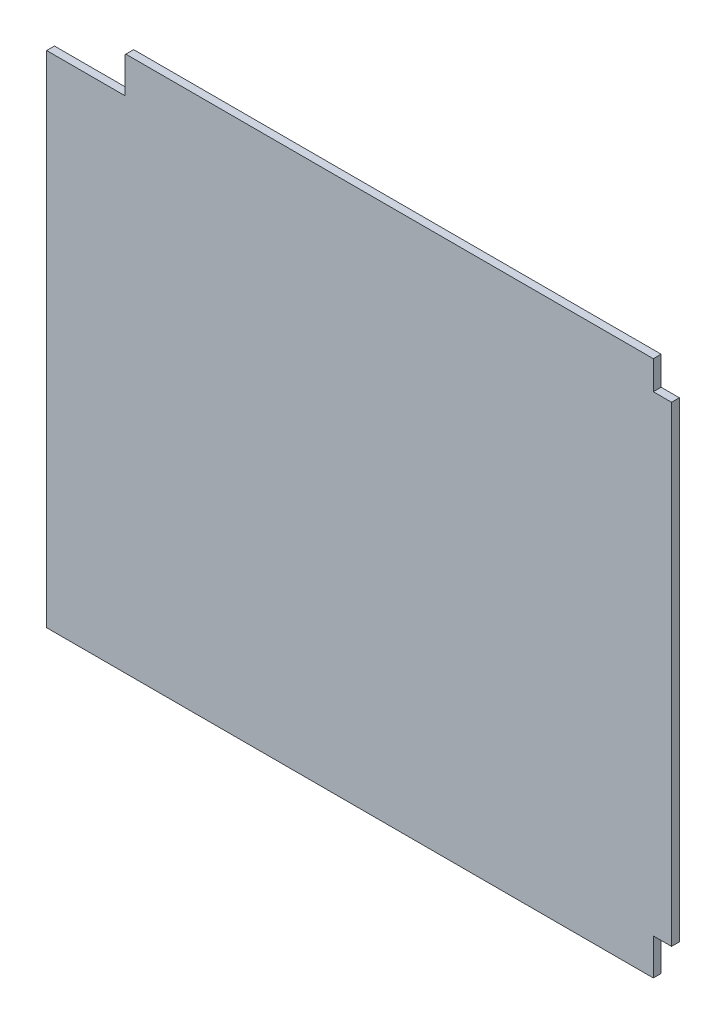
ISO-10303-21;
HEADER;
FILE_DESCRIPTION(('STEP AP214'),'2;1');
FILE_NAME('part.step','',(''),(''),'','','');
FILE_SCHEMA(('AUTOMOTIVE_DESIGN { 1 0 10303 214 1 1 1 1 }'));
ENDSEC;
DATA;
#1=APPLICATION_CONTEXT('core data for automotive mechanical design processes');
#2=APPLICATION_PROTOCOL_DEFINITION('international standard','automotive_design',2000,#1);
#3=PRODUCT_CONTEXT('',#1,'mechanical');
#4=PRODUCT('Part','Part','',(#3));
#5=PRODUCT_RELATED_PRODUCT_CATEGORY('part','',(#4));
#6=PRODUCT_DEFINITION_FORMATION('','',#4);
#7=PRODUCT_DEFINITION_CONTEXT('part definition',#1,'design');
#8=PRODUCT_DEFINITION('design','',#6,#7);
#9=PRODUCT_DEFINITION_SHAPE('','',#8);
#10=(LENGTH_UNIT() NAMED_UNIT(*) SI_UNIT(.MILLI.,.METRE.));
#11=(NAMED_UNIT(*) PLANE_ANGLE_UNIT() SI_UNIT($,.RADIAN.));
#12=(NAMED_UNIT(*) SI_UNIT($,.STERADIAN.) SOLID_ANGLE_UNIT());
#13=UNCERTAINTY_MEASURE_WITH_UNIT(LENGTH_MEASURE(1.E-05),#10,'distance_accuracy_value','');
#14=(GEOMETRIC_REPRESENTATION_CONTEXT(3) GLOBAL_UNCERTAINTY_ASSIGNED_CONTEXT((#13)) GLOBAL_UNIT_ASSIGNED_CONTEXT((#10,
#11,#12)) REPRESENTATION_CONTEXT('',''));
#15=CARTESIAN_POINT('',(0.,0.,0.));
#16=DIRECTION('',(0.,0.,1.));
#17=DIRECTION('',(1.,0.,0.));
#18=AXIS2_PLACEMENT_3D('',#15,#16,#17);
#19=CARTESIAN_POINT('',(0.,82.4496359223304,3.));
#20=DIRECTION('',(0.,-1.,0.));
#21=DIRECTION('',(0.,0.,-1.));
#22=AXIS2_PLACEMENT_3D('',#19,#20,#21);
#23=PLANE('',#22);
#24=DIRECTION('',(-1.,0.,0.));
#25=VECTOR('',#24,1.);
#26=CARTESIAN_POINT('',(0.,82.4496359223304,0.));
#27=LINE('',#26,#25);
#28=CARTESIAN_POINT('',(-87.0384595395548,82.4496359223304,0.));
#29=VERTEX_POINT('',#28);
#30=CARTESIAN_POINT('',(-117.038459539553,82.4496359223304,0.));
#31=VERTEX_POINT('',#30);
#32=EDGE_CURVE('E164',#29,#31,#27,.T.);
#33=ORIENTED_EDGE('',*,*,#32,.T.);
#34=DIRECTION('',(0.,0.,-1.));
#35=VECTOR('',#34,1.);
#36=CARTESIAN_POINT('',(-117.038459539553,82.4496359223304,3.));
#37=LINE('',#36,#35);
#38=CARTESIAN_POINT('',(-117.038459539553,82.4496359223304,3.));
#39=VERTEX_POINT('',#38);
#40=EDGE_CURVE('E11',#39,#31,#37,.T.);
#41=ORIENTED_EDGE('',*,*,#40,.F.);
#42=DIRECTION('',(-1.,0.,0.));
#43=VECTOR('',#42,1.);
#44=CARTESIAN_POINT('',(0.,82.4496359223304,3.));
#45=LINE('',#44,#43);
#46=CARTESIAN_POINT('',(-87.0384595395548,82.4496359223304,3.));
#47=VERTEX_POINT('',#46);
#48=EDGE_CURVE('E195',#47,#39,#45,.T.);
#49=ORIENTED_EDGE('',*,*,#48,.F.);
#50=DIRECTION('',(0.,0.,-1.));
#51=VECTOR('',#50,1.);
#52=CARTESIAN_POINT('',(-87.0384595395548,82.4496359223304,3.));
#53=LINE('',#52,#51);
#54=EDGE_CURVE('E160',#47,#29,#53,.T.);
#55=ORIENTED_EDGE('',*,*,#54,.T.);
#56=EDGE_LOOP('',(#33,#41,#49,#55));
#57=FACE_BOUND('',#56,.T.);
#58=ADVANCED_FACE('F45',(#57),#23,.F.);
#59=CARTESIAN_POINT('',(-117.038459539553,0.,3.));
#60=DIRECTION('',(1.,0.,0.));
#61=DIRECTION('',(0.,0.,-1.));
#62=AXIS2_PLACEMENT_3D('',#59,#60,#61);
#63=PLANE('',#62);
#64=DIRECTION('',(0.,-1.,0.));
#65=VECTOR('',#64,1.);
#66=CARTESIAN_POINT('',(-117.038459539553,0.,0.));
#67=LINE('',#66,#65);
#68=CARTESIAN_POINT('',(-117.038459539553,-109.55036407767,0.));
#69=VERTEX_POINT('',#68);
#70=EDGE_CURVE('E168',#31,#69,#67,.T.);
#71=ORIENTED_EDGE('',*,*,#70,.T.);
#72=DIRECTION('',(0.,0.,-1.));
#73=VECTOR('',#72,1.);
#74=CARTESIAN_POINT('',(-117.038459539553,-109.55036407767,3.));
#75=LINE('',#74,#73);
#76=CARTESIAN_POINT('',(-117.038459539553,-109.55036407767,3.));
#77=VERTEX_POINT('',#76);
#78=EDGE_CURVE('E54',#77,#69,#75,.T.);
#79=ORIENTED_EDGE('',*,*,#78,.F.);
#80=DIRECTION('',(0.,-1.,0.));
#81=VECTOR('',#80,1.);
#82=CARTESIAN_POINT('',(-117.038459539553,0.,3.));
#83=LINE('',#82,#81);
#84=EDGE_CURVE('E114',#39,#77,#83,.T.);
#85=ORIENTED_EDGE('',*,*,#84,.F.);
#86=ORIENTED_EDGE('',*,*,#40,.T.);
#87=EDGE_LOOP('',(#71,#79,#85,#86));
#88=FACE_BOUND('',#87,.T.);
#89=ADVANCED_FACE('F281',(#88),#63,.F.);
#90=CARTESIAN_POINT('',(0.,-109.55036407767,3.));
#91=DIRECTION('',(0.,1.,0.));
#92=DIRECTION('',(0.,0.,1.));
#93=AXIS2_PLACEMENT_3D('',#90,#91,#92);
#94=PLANE('',#93);
#95=DIRECTION('',(1.,0.,0.));
#96=VECTOR('',#95,1.);
#97=CARTESIAN_POINT('',(0.,-109.55036407767,0.));
#98=LINE('',#97,#96);
#99=CARTESIAN_POINT('',(115.961540460445,-109.55036407767,0.));
#100=VERTEX_POINT('',#99);
#101=EDGE_CURVE('E171',#69,#100,#98,.T.);
#102=ORIENTED_EDGE('',*,*,#101,.T.);
#103=DIRECTION('',(0.,0.,-1.));
#104=VECTOR('',#103,1.);
#105=CARTESIAN_POINT('',(115.961540460445,-109.55036407767,3.));
#106=LINE('',#105,#104);
#107=CARTESIAN_POINT('',(115.961540460445,-109.55036407767,3.));
#108=VERTEX_POINT('',#107);
#109=EDGE_CURVE('E218',#108,#100,#106,.T.);
#110=ORIENTED_EDGE('',*,*,#109,.F.);
#111=DIRECTION('',(1.,0.,0.));
#112=VECTOR('',#111,1.);
#113=CARTESIAN_POINT('',(0.,-109.55036407767,3.));
#114=LINE('',#113,#112);
#115=EDGE_CURVE('E228',#77,#108,#114,.T.);
#116=ORIENTED_EDGE('',*,*,#115,.F.);
#117=ORIENTED_EDGE('',*,*,#78,.T.);
#118=EDGE_LOOP('',(#102,#110,#116,#117));
#119=FACE_BOUND('',#118,.T.);
#120=ADVANCED_FACE('F226',(#119),#94,.F.);
#121=CARTESIAN_POINT('',(115.961540460445,0.,3.));
#122=DIRECTION('',(-1.,0.,0.));
#123=DIRECTION('',(0.,0.,1.));
#124=AXIS2_PLACEMENT_3D('',#121,#122,#123);
#125=PLANE('',#124);
#126=DIRECTION('',(0.,1.,0.));
#127=VECTOR('',#126,1.);
#128=CARTESIAN_POINT('',(115.961540460445,0.,0.));
#129=LINE('',#128,#127);
#130=CARTESIAN_POINT('',(115.961540460445,-95.5503640776701,0.));
#131=VERTEX_POINT('',#130);
#132=EDGE_CURVE('E174',#100,#131,#129,.T.);
#133=ORIENTED_EDGE('',*,*,#132,.T.);
#134=DIRECTION('',(0.,0.,-1.));
#135=VECTOR('',#134,1.);
#136=CARTESIAN_POINT('',(115.961540460445,-95.5503640776701,3.));
#137=LINE('',#136,#135);
#138=CARTESIAN_POINT('',(115.961540460445,-95.5503640776701,3.));
#139=VERTEX_POINT('',#138);
#140=EDGE_CURVE('E214',#139,#131,#137,.T.);
#141=ORIENTED_EDGE('',*,*,#140,.F.);
#142=DIRECTION('',(0.,1.,0.));
#143=VECTOR('',#142,1.);
#144=CARTESIAN_POINT('',(115.961540460445,0.,3.));
#145=LINE('',#144,#143);
#146=EDGE_CURVE('E247',#108,#139,#145,.T.);
#147=ORIENTED_EDGE('',*,*,#146,.F.);
#148=ORIENTED_EDGE('',*,*,#109,.T.);
#149=EDGE_LOOP('',(#133,#141,#147,#148));
#150=FACE_BOUND('',#149,.T.);
#151=ADVANCED_FACE('F237',(#150),#125,.F.);
#152=CARTESIAN_POINT('',(0.,-95.5503640776701,3.));
#153=DIRECTION('',(0.,1.,0.));
#154=DIRECTION('',(0.,0.,1.));
#155=AXIS2_PLACEMENT_3D('',#152,#153,#154);
#156=PLANE('',#155);
#157=DIRECTION('',(1.,0.,0.));
#158=VECTOR('',#157,1.);
#159=CARTESIAN_POINT('',(0.,-95.5503640776701,0.));
#160=LINE('',#159,#158);
#161=CARTESIAN_POINT('',(122.961540460445,-95.5503640776701,0.));
#162=VERTEX_POINT('',#161);
#163=EDGE_CURVE('E177',#131,#162,#160,.T.);
#164=ORIENTED_EDGE('',*,*,#163,.T.);
#165=DIRECTION('',(0.,0.,-1.));
#166=VECTOR('',#165,1.);
#167=CARTESIAN_POINT('',(122.961540460445,-95.5503640776701,3.));
#168=LINE('',#167,#166);
#169=CARTESIAN_POINT('',(122.961540460445,-95.5503640776701,3.));
#170=VERTEX_POINT('',#169);
#171=EDGE_CURVE('E210',#170,#162,#168,.T.);
#172=ORIENTED_EDGE('',*,*,#171,.F.);
#173=DIRECTION('',(1.,0.,0.));
#174=VECTOR('',#173,1.);
#175=CARTESIAN_POINT('',(0.,-95.5503640776701,3.));
#176=LINE('',#175,#174);
#177=EDGE_CURVE('E243',#139,#170,#176,.T.);
#178=ORIENTED_EDGE('',*,*,#177,.F.);
#179=ORIENTED_EDGE('',*,*,#140,.T.);
#180=EDGE_LOOP('',(#164,#172,#178,#179));
#181=FACE_BOUND('',#180,.T.);
#182=ADVANCED_FACE('F241',(#181),#156,.F.);
#183=CARTESIAN_POINT('',(122.961540460445,0.,3.));
#184=DIRECTION('',(-1.,0.,0.));
#185=DIRECTION('',(0.,0.,1.));
#186=AXIS2_PLACEMENT_3D('',#183,#184,#185);
#187=PLANE('',#186);
#188=DIRECTION('',(0.,1.,0.));
#189=VECTOR('',#188,1.);
#190=CARTESIAN_POINT('',(122.961540460445,0.,0.));
#191=LINE('',#190,#189);
#192=CARTESIAN_POINT('',(122.961540460445,85.449635922332,0.));
#193=VERTEX_POINT('',#192);
#194=EDGE_CURVE('E180',#162,#193,#191,.T.);
#195=ORIENTED_EDGE('',*,*,#194,.T.);
#196=DIRECTION('',(0.,0.,-1.));
#197=VECTOR('',#196,1.);
#198=CARTESIAN_POINT('',(122.961540460445,85.449635922332,3.));
#199=LINE('',#198,#197);
#200=CARTESIAN_POINT('',(122.961540460445,85.449635922332,3.));
#201=VERTEX_POINT('',#200);
#202=EDGE_CURVE('E206',#201,#193,#199,.T.);
#203=ORIENTED_EDGE('',*,*,#202,.F.);
#204=DIRECTION('',(0.,1.,0.));
#205=VECTOR('',#204,1.);
#206=CARTESIAN_POINT('',(122.961540460445,0.,3.));
#207=LINE('',#206,#205);
#208=EDGE_CURVE('E246',#170,#201,#207,.T.);
#209=ORIENTED_EDGE('',*,*,#208,.F.);
#210=ORIENTED_EDGE('',*,*,#171,.T.);
#211=EDGE_LOOP('',(#195,#203,#209,#210));
#212=FACE_BOUND('',#211,.T.);
#213=ADVANCED_FACE('F294',(#212),#187,.F.);
#214=CARTESIAN_POINT('',(0.,85.449635922332,3.));
#215=DIRECTION('',(0.,-1.,0.));
#216=DIRECTION('',(0.,0.,-1.));
#217=AXIS2_PLACEMENT_3D('',#214,#215,#216);
#218=PLANE('',#217);
#219=DIRECTION('',(-1.,0.,0.));
#220=VECTOR('',#219,1.);
#221=CARTESIAN_POINT('',(0.,85.449635922332,0.));
#222=LINE('',#221,#220);
#223=CARTESIAN_POINT('',(115.961540460445,85.449635922332,0.));
#224=VERTEX_POINT('',#223);
#225=EDGE_CURVE('E183',#193,#224,#222,.T.);
#226=ORIENTED_EDGE('',*,*,#225,.T.);
#227=DIRECTION('',(0.,0.,-1.));
#228=VECTOR('',#227,1.);
#229=CARTESIAN_POINT('',(115.961540460445,85.449635922332,3.));
#230=LINE('',#229,#228);
#231=CARTESIAN_POINT('',(115.961540460445,85.449635922332,3.));
#232=VERTEX_POINT('',#231);
#233=EDGE_CURVE('E202',#232,#224,#230,.T.);
#234=ORIENTED_EDGE('',*,*,#233,.F.);
#235=DIRECTION('',(-1.,0.,0.));
#236=VECTOR('',#235,1.);
#237=CARTESIAN_POINT('',(0.,85.449635922332,3.));
#238=LINE('',#237,#236);
#239=EDGE_CURVE('E251',#201,#232,#238,.T.);
#240=ORIENTED_EDGE('',*,*,#239,.F.);
#241=ORIENTED_EDGE('',*,*,#202,.T.);
#242=EDGE_LOOP('',(#226,#234,#240,#241));
#243=FACE_BOUND('',#242,.T.);
#244=ADVANCED_FACE('F262',(#243),#218,.F.);
#245=CARTESIAN_POINT('',(115.961540460445,0.,3.));
#246=DIRECTION('',(-1.,0.,0.));
#247=DIRECTION('',(0.,0.,1.));
#248=AXIS2_PLACEMENT_3D('',#245,#246,#247);
#249=PLANE('',#248);
#250=DIRECTION('',(0.,1.,0.));
#251=VECTOR('',#250,1.);
#252=CARTESIAN_POINT('',(115.961540460445,0.,0.));
#253=LINE('',#252,#251);
#254=CARTESIAN_POINT('',(115.961540460445,96.4496359223304,0.));
#255=VERTEX_POINT('',#254);
#256=EDGE_CURVE('E186',#224,#255,#253,.T.);
#257=ORIENTED_EDGE('',*,*,#256,.T.);
#258=DIRECTION('',(0.,0.,-1.));
#259=VECTOR('',#258,1.);
#260=CARTESIAN_POINT('',(115.961540460445,96.4496359223304,3.));
#261=LINE('',#260,#259);
#262=CARTESIAN_POINT('',(115.961540460445,96.4496359223304,3.));
#263=VERTEX_POINT('',#262);
#264=EDGE_CURVE('E153',#263,#255,#261,.T.);
#265=ORIENTED_EDGE('',*,*,#264,.F.);
#266=DIRECTION('',(0.,1.,0.));
#267=VECTOR('',#266,1.);
#268=CARTESIAN_POINT('',(115.961540460445,0.,3.));
#269=LINE('',#268,#267);
#270=EDGE_CURVE('E142',#232,#263,#269,.T.);
#271=ORIENTED_EDGE('',*,*,#270,.F.);
#272=ORIENTED_EDGE('',*,*,#233,.T.);
#273=EDGE_LOOP('',(#257,#265,#271,#272));
#274=FACE_BOUND('',#273,.T.);
#275=ADVANCED_FACE('F266',(#274),#249,.F.);
#276=CARTESIAN_POINT('',(0.,96.4496359223304,3.));
#277=DIRECTION('',(0.,-1.,0.));
#278=DIRECTION('',(0.,0.,-1.));
#279=AXIS2_PLACEMENT_3D('',#276,#277,#278);
#280=PLANE('',#279);
#281=DIRECTION('',(-1.,0.,0.));
#282=VECTOR('',#281,1.);
#283=CARTESIAN_POINT('',(0.,96.4496359223304,0.));
#284=LINE('',#283,#282);
#285=CARTESIAN_POINT('',(-86.6242459771817,96.4496359223304,0.));
#286=VERTEX_POINT('',#285);
#287=EDGE_CURVE('E151',#255,#286,#284,.T.);
#288=ORIENTED_EDGE('',*,*,#287,.T.);
#289=DIRECTION('',(0.,0.,-1.));
#290=VECTOR('',#289,1.);
#291=CARTESIAN_POINT('',(-86.6242459771817,96.4496359223304,3.));
#292=LINE('',#291,#290);
#293=CARTESIAN_POINT('',(-86.6242459771817,96.4496359223304,3.));
#294=VERTEX_POINT('',#293);
#295=EDGE_CURVE('E148',#294,#286,#292,.T.);
#296=ORIENTED_EDGE('',*,*,#295,.F.);
#297=DIRECTION('',(-1.,0.,0.));
#298=VECTOR('',#297,1.);
#299=CARTESIAN_POINT('',(0.,96.4496359223304,3.));
#300=LINE('',#299,#298);
#301=EDGE_CURVE('E136',#263,#294,#300,.T.);
#302=ORIENTED_EDGE('',*,*,#301,.F.);
#303=ORIENTED_EDGE('',*,*,#264,.T.);
#304=EDGE_LOOP('',(#288,#296,#302,#303));
#305=FACE_BOUND('',#304,.T.);
#306=ADVANCED_FACE('F149',(#305),#280,.F.);
#307=CARTESIAN_POINT('',(-91.536940949756,91.536940949756,3.));
#308=DIRECTION('',(0.707106781186547,-0.707106781186547,0.));
#309=DIRECTION('',(0.707106781186548,0.707106781186548,0.));
#310=AXIS2_PLACEMENT_3D('',#307,#308,#309);
#311=PLANE('',#310);
#312=DIRECTION('',(-0.707106781186548,-0.707106781186548,0.));
#313=VECTOR('',#312,1.);
#314=CARTESIAN_POINT('',(-91.536940949756,91.536940949756,0.));
#315=LINE('',#314,#313);
#316=CARTESIAN_POINT('',(-87.0384595395548,96.0354223599573,0.));
#317=VERTEX_POINT('',#316);
#318=EDGE_CURVE('E100',#286,#317,#315,.T.);
#319=ORIENTED_EDGE('',*,*,#318,.T.);
#320=DIRECTION('',(0.,0.,-1.));
#321=VECTOR('',#320,1.);
#322=CARTESIAN_POINT('',(-87.0384595395548,96.0354223599573,3.));
#323=LINE('',#322,#321);
#324=CARTESIAN_POINT('',(-87.0384595395548,96.0354223599573,3.));
#325=VERTEX_POINT('',#324);
#326=EDGE_CURVE('E154',#325,#317,#323,.T.);
#327=ORIENTED_EDGE('',*,*,#326,.F.);
#328=DIRECTION('',(-0.707106781186548,-0.707106781186548,0.));
#329=VECTOR('',#328,1.);
#330=CARTESIAN_POINT('',(-91.536940949756,91.536940949756,3.));
#331=LINE('',#330,#329);
#332=EDGE_CURVE('E140',#294,#325,#331,.T.);
#333=ORIENTED_EDGE('',*,*,#332,.F.);
#334=ORIENTED_EDGE('',*,*,#295,.T.);
#335=EDGE_LOOP('',(#319,#327,#333,#334));
#336=FACE_BOUND('',#335,.T.);
#337=ADVANCED_FACE('F156',(#336),#311,.F.);
#338=CARTESIAN_POINT('',(-87.0384595395548,0.,3.));
#339=DIRECTION('',(1.,0.,0.));
#340=DIRECTION('',(0.,0.,-1.));
#341=AXIS2_PLACEMENT_3D('',#338,#339,#340);
#342=PLANE('',#341);
#343=DIRECTION('',(0.,-1.,0.));
#344=VECTOR('',#343,1.);
#345=CARTESIAN_POINT('',(-87.0384595395548,0.,0.));
#346=LINE('',#345,#344);
#347=EDGE_CURVE('E106',#317,#29,#346,.T.);
#348=ORIENTED_EDGE('',*,*,#347,.T.);
#349=ORIENTED_EDGE('',*,*,#54,.F.);
#350=DIRECTION('',(0.,-1.,0.));
#351=VECTOR('',#350,1.);
#352=CARTESIAN_POINT('',(-87.0384595395548,0.,3.));
#353=LINE('',#352,#351);
#354=EDGE_CURVE('E62',#325,#47,#353,.T.);
#355=ORIENTED_EDGE('',*,*,#354,.F.);
#356=ORIENTED_EDGE('',*,*,#326,.T.);
#357=EDGE_LOOP('',(#348,#349,#355,#356));
#358=FACE_BOUND('',#357,.T.);
#359=ADVANCED_FACE('F270',(#358),#342,.F.);
#360=CARTESIAN_POINT('',(0.,0.,3.));
#361=DIRECTION('',(0.,0.,1.));
#362=DIRECTION('',(1.,0.,0.));
#363=AXIS2_PLACEMENT_3D('',#360,#361,#362);
#364=PLANE('',#363);
#365=ORIENTED_EDGE('',*,*,#48,.T.);
#366=ORIENTED_EDGE('',*,*,#84,.T.);
#367=ORIENTED_EDGE('',*,*,#115,.T.);
#368=ORIENTED_EDGE('',*,*,#146,.T.);
#369=ORIENTED_EDGE('',*,*,#177,.T.);
#370=ORIENTED_EDGE('',*,*,#208,.T.);
#371=ORIENTED_EDGE('',*,*,#239,.T.);
#372=ORIENTED_EDGE('',*,*,#270,.T.);
#373=ORIENTED_EDGE('',*,*,#301,.T.);
#374=ORIENTED_EDGE('',*,*,#332,.T.);
#375=ORIENTED_EDGE('',*,*,#354,.T.);
#376=EDGE_LOOP('',(#365,#366,#367,#368,#369,#370,#371,#372,#373,#374,#375));
#377=FACE_BOUND('',#376,.T.);
#378=ADVANCED_FACE('F138',(#377),#364,.T.);
#379=CARTESIAN_POINT('',(0.,0.,0.));
#380=DIRECTION('',(0.,0.,1.));
#381=DIRECTION('',(1.,0.,0.));
#382=AXIS2_PLACEMENT_3D('',#379,#380,#381);
#383=PLANE('',#382);
#384=ORIENTED_EDGE('',*,*,#32,.F.);
#385=ORIENTED_EDGE('',*,*,#347,.F.);
#386=ORIENTED_EDGE('',*,*,#318,.F.);
#387=ORIENTED_EDGE('',*,*,#287,.F.);
#388=ORIENTED_EDGE('',*,*,#256,.F.);
#389=ORIENTED_EDGE('',*,*,#225,.F.);
#390=ORIENTED_EDGE('',*,*,#194,.F.);
#391=ORIENTED_EDGE('',*,*,#163,.F.);
#392=ORIENTED_EDGE('',*,*,#132,.F.);
#393=ORIENTED_EDGE('',*,*,#101,.F.);
#394=ORIENTED_EDGE('',*,*,#70,.F.);
#395=EDGE_LOOP('',(#384,#385,#386,#387,#388,#389,#390,#391,#392,#393,#394));
#396=FACE_BOUND('',#395,.T.);
#397=ADVANCED_FACE('F232',(#396),#383,.F.);
#398=CLOSED_SHELL('',(#58,#89,#120,#151,#182,#213,#244,#275,#306,#337,#359,#378,#397));
#399=MANIFOLD_SOLID_BREP('B2',#398);
#400=ADVANCED_BREP_SHAPE_REPRESENTATION('',(#18,#399),#14);
#401=SHAPE_DEFINITION_REPRESENTATION(#9,#400);
ENDSEC;
END-ISO-10303-21;
